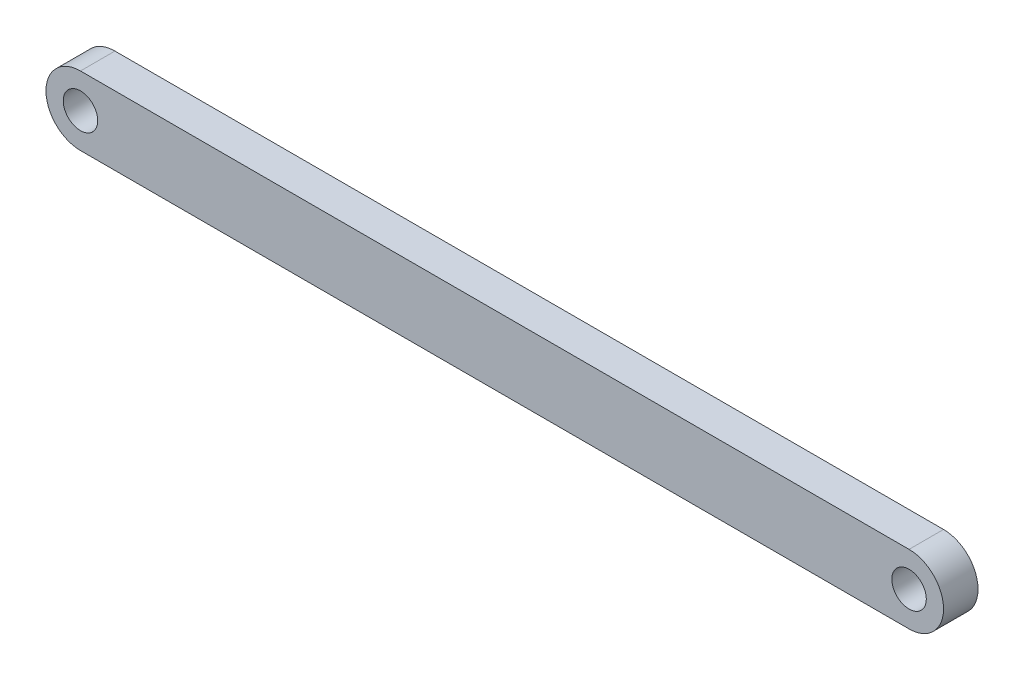
ISO-10303-21;
HEADER;
FILE_DESCRIPTION(('STEP AP214'),'2;1');
FILE_NAME('part.step','',(''),(''),'','','');
FILE_SCHEMA(('AUTOMOTIVE_DESIGN { 1 0 10303 214 1 1 1 1 }'));
ENDSEC;
DATA;
#1=APPLICATION_CONTEXT('core data for automotive mechanical design processes');
#2=APPLICATION_PROTOCOL_DEFINITION('international standard','automotive_design',2000,#1);
#3=PRODUCT_CONTEXT('',#1,'mechanical');
#4=PRODUCT('Part','Part','',(#3));
#5=PRODUCT_RELATED_PRODUCT_CATEGORY('part','',(#4));
#6=PRODUCT_DEFINITION_FORMATION('','',#4);
#7=PRODUCT_DEFINITION_CONTEXT('part definition',#1,'design');
#8=PRODUCT_DEFINITION('design','',#6,#7);
#9=PRODUCT_DEFINITION_SHAPE('','',#8);
#10=(LENGTH_UNIT() NAMED_UNIT(*) SI_UNIT(.MILLI.,.METRE.));
#11=(NAMED_UNIT(*) PLANE_ANGLE_UNIT() SI_UNIT($,.RADIAN.));
#12=(NAMED_UNIT(*) SI_UNIT($,.STERADIAN.) SOLID_ANGLE_UNIT());
#13=UNCERTAINTY_MEASURE_WITH_UNIT(LENGTH_MEASURE(1.E-05),#10,'distance_accuracy_value','');
#14=(GEOMETRIC_REPRESENTATION_CONTEXT(3) GLOBAL_UNCERTAINTY_ASSIGNED_CONTEXT((#13)) GLOBAL_UNIT_ASSIGNED_CONTEXT((#10,
#11,#12)) REPRESENTATION_CONTEXT('',''));
#15=CARTESIAN_POINT('',(0.,0.,0.));
#16=DIRECTION('',(0.,0.,1.));
#17=DIRECTION('',(1.,0.,0.));
#18=AXIS2_PLACEMENT_3D('',#15,#16,#17);
#19=CARTESIAN_POINT('',(-24.0399999679991,0.00124040432424641,2.));
#20=DIRECTION('',(0.,0.,1.));
#21=DIRECTION('',(1.,0.,0.));
#22=AXIS2_PLACEMENT_3D('',#19,#20,#21);
#23=PLANE('',#22);
#24=CARTESIAN_POINT('',(-24.0399999679991,0.00124040432424641,2.));
#25=DIRECTION('',(0.,0.,1.));
#26=DIRECTION('',(1.,0.,0.));
#27=AXIS2_PLACEMENT_3D('',#24,#25,#26);
#28=CIRCLE('',#27,1.);
#29=CARTESIAN_POINT('',(-23.0399999679991,0.00124040432424641,2.));
#30=VERTEX_POINT('',#29);
#31=EDGE_CURVE('E100',#30,#30,#28,.T.);
#32=ORIENTED_EDGE('',*,*,#31,.F.);
#33=EDGE_LOOP('',(#32));
#34=FACE_BOUND('',#33,.T.);
#35=CARTESIAN_POINT('',(-24.0399999679991,0.00124040432424641,2.));
#36=DIRECTION('',(0.,0.,1.));
#37=DIRECTION('',(1.,0.,0.));
#38=AXIS2_PLACEMENT_3D('',#35,#36,#37);
#39=CIRCLE('',#38,2.);
#40=CARTESIAN_POINT('',(-24.0399999679991,2.00124040432425,2.));
#41=VERTEX_POINT('',#40);
#42=CARTESIAN_POINT('',(-24.0399999679991,-1.99875959567575,2.));
#43=VERTEX_POINT('',#42);
#44=EDGE_CURVE('E85',#41,#43,#39,.T.);
#45=ORIENTED_EDGE('',*,*,#44,.T.);
#46=DIRECTION('',(1.,0.,0.));
#47=VECTOR('',#46,1.);
#48=CARTESIAN_POINT('',(-24.0399999679991,-1.99875959567575,2.));
#49=LINE('',#48,#47);
#50=CARTESIAN_POINT('',(24.0400000320009,-1.99875959567575,2.));
#51=VERTEX_POINT('',#50);
#52=EDGE_CURVE('E80',#43,#51,#49,.T.);
#53=ORIENTED_EDGE('',*,*,#52,.T.);
#54=CARTESIAN_POINT('',(24.0400000320009,0.00124040432424641,2.));
#55=DIRECTION('',(0.,0.,1.));
#56=DIRECTION('',(1.,0.,0.));
#57=AXIS2_PLACEMENT_3D('',#54,#55,#56);
#58=CIRCLE('',#57,2.);
#59=CARTESIAN_POINT('',(24.0400000320009,2.00124040432425,2.));
#60=VERTEX_POINT('',#59);
#61=EDGE_CURVE('E83',#51,#60,#58,.T.);
#62=ORIENTED_EDGE('',*,*,#61,.T.);
#63=DIRECTION('',(-1.,0.,0.));
#64=VECTOR('',#63,1.);
#65=CARTESIAN_POINT('',(-24.0399999679991,2.00124040432425,2.));
#66=LINE('',#65,#64);
#67=EDGE_CURVE('E50',#60,#41,#66,.T.);
#68=ORIENTED_EDGE('',*,*,#67,.T.);
#69=EDGE_LOOP('',(#45,#53,#62,#68));
#70=FACE_BOUND('',#69,.T.);
#71=CARTESIAN_POINT('',(24.0400000320009,0.00124040432424641,2.));
#72=DIRECTION('',(0.,0.,1.));
#73=DIRECTION('',(1.,0.,0.));
#74=AXIS2_PLACEMENT_3D('',#71,#72,#73);
#75=CIRCLE('',#74,1.);
#76=CARTESIAN_POINT('',(25.0400000320009,0.00124040432424641,2.));
#77=VERTEX_POINT('',#76);
#78=EDGE_CURVE('E115',#77,#77,#75,.T.);
#79=ORIENTED_EDGE('',*,*,#78,.F.);
#80=EDGE_LOOP('',(#79));
#81=FACE_BOUND('',#80,.T.);
#82=ADVANCED_FACE('F33',(#34,#70,#81),#23,.T.);
#83=CARTESIAN_POINT('',(-24.0399999679991,0.00124040432424641,0.));
#84=DIRECTION('',(0.,0.,1.));
#85=DIRECTION('',(1.,0.,0.));
#86=AXIS2_PLACEMENT_3D('',#83,#84,#85);
#87=PLANE('',#86);
#88=CARTESIAN_POINT('',(-24.0399999679991,0.00124040432424641,0.));
#89=DIRECTION('',(0.,0.,1.));
#90=DIRECTION('',(1.,0.,0.));
#91=AXIS2_PLACEMENT_3D('',#88,#89,#90);
#92=CIRCLE('',#91,2.);
#93=CARTESIAN_POINT('',(-24.0399999679991,2.00124040432425,0.));
#94=VERTEX_POINT('',#93);
#95=CARTESIAN_POINT('',(-24.0399999679991,-1.99875959567575,0.));
#96=VERTEX_POINT('',#95);
#97=EDGE_CURVE('E97',#94,#96,#92,.T.);
#98=ORIENTED_EDGE('',*,*,#97,.F.);
#99=DIRECTION('',(-1.,0.,0.));
#100=VECTOR('',#99,1.);
#101=CARTESIAN_POINT('',(-24.0399999679991,2.00124040432425,0.));
#102=LINE('',#101,#100);
#103=CARTESIAN_POINT('',(24.0400000320009,2.00124040432425,0.));
#104=VERTEX_POINT('',#103);
#105=EDGE_CURVE('E73',#104,#94,#102,.T.);
#106=ORIENTED_EDGE('',*,*,#105,.F.);
#107=CARTESIAN_POINT('',(24.0400000320009,0.00124040432424641,0.));
#108=DIRECTION('',(0.,0.,1.));
#109=DIRECTION('',(1.,0.,0.));
#110=AXIS2_PLACEMENT_3D('',#107,#108,#109);
#111=CIRCLE('',#110,2.);
#112=CARTESIAN_POINT('',(24.0400000320009,-1.99875959567575,0.));
#113=VERTEX_POINT('',#112);
#114=EDGE_CURVE('E67',#113,#104,#111,.T.);
#115=ORIENTED_EDGE('',*,*,#114,.F.);
#116=DIRECTION('',(1.,0.,0.));
#117=VECTOR('',#116,1.);
#118=CARTESIAN_POINT('',(-24.0399999679991,-1.99875959567575,0.));
#119=LINE('',#118,#117);
#120=EDGE_CURVE('E89',#96,#113,#119,.T.);
#121=ORIENTED_EDGE('',*,*,#120,.F.);
#122=EDGE_LOOP('',(#98,#106,#115,#121));
#123=FACE_BOUND('',#122,.T.);
#124=CARTESIAN_POINT('',(-24.0399999679991,0.00124040432424641,0.));
#125=DIRECTION('',(0.,0.,1.));
#126=DIRECTION('',(1.,0.,0.));
#127=AXIS2_PLACEMENT_3D('',#124,#125,#126);
#128=CIRCLE('',#127,1.);
#129=CARTESIAN_POINT('',(-23.0399999679991,0.00124040432424641,0.));
#130=VERTEX_POINT('',#129);
#131=EDGE_CURVE('E112',#130,#130,#128,.T.);
#132=ORIENTED_EDGE('',*,*,#131,.T.);
#133=EDGE_LOOP('',(#132));
#134=FACE_BOUND('',#133,.T.);
#135=CARTESIAN_POINT('',(24.0400000320009,0.00124040432424641,0.));
#136=DIRECTION('',(0.,0.,1.));
#137=DIRECTION('',(1.,0.,0.));
#138=AXIS2_PLACEMENT_3D('',#135,#136,#137);
#139=CIRCLE('',#138,1.);
#140=CARTESIAN_POINT('',(25.0400000320009,0.00124040432424641,0.));
#141=VERTEX_POINT('',#140);
#142=EDGE_CURVE('E118',#141,#141,#139,.T.);
#143=ORIENTED_EDGE('',*,*,#142,.T.);
#144=EDGE_LOOP('',(#143));
#145=FACE_BOUND('',#144,.T.);
#146=ADVANCED_FACE('F108',(#123,#134,#145),#87,.F.);
#147=CARTESIAN_POINT('',(-24.0399999679991,0.00124040432424641,2.));
#148=DIRECTION('',(0.,0.,-1.));
#149=DIRECTION('',(-1.,0.,0.));
#150=AXIS2_PLACEMENT_3D('',#147,#148,#149);
#151=CYLINDRICAL_SURFACE('',#150,2.);
#152=ORIENTED_EDGE('',*,*,#97,.T.);
#153=DIRECTION('',(0.,0.,-1.));
#154=VECTOR('',#153,1.);
#155=CARTESIAN_POINT('',(-24.0399999679991,-1.99875959567575,2.));
#156=LINE('',#155,#154);
#157=EDGE_CURVE('E11',#43,#96,#156,.T.);
#158=ORIENTED_EDGE('',*,*,#157,.F.);
#159=ORIENTED_EDGE('',*,*,#44,.F.);
#160=DIRECTION('',(0.,0.,-1.));
#161=VECTOR('',#160,1.);
#162=CARTESIAN_POINT('',(-24.0399999679991,2.00124040432425,2.));
#163=LINE('',#162,#161);
#164=EDGE_CURVE('E93',#41,#94,#163,.T.);
#165=ORIENTED_EDGE('',*,*,#164,.T.);
#166=EDGE_LOOP('',(#152,#158,#159,#165));
#167=FACE_BOUND('',#166,.T.);
#168=ADVANCED_FACE('F35',(#167),#151,.T.);
#169=CARTESIAN_POINT('',(-24.0399999679991,-1.99875959567575,2.));
#170=DIRECTION('',(0.,1.,0.));
#171=DIRECTION('',(0.,0.,1.));
#172=AXIS2_PLACEMENT_3D('',#169,#170,#171);
#173=PLANE('',#172);
#174=ORIENTED_EDGE('',*,*,#120,.T.);
#175=DIRECTION('',(0.,0.,-1.));
#176=VECTOR('',#175,1.);
#177=CARTESIAN_POINT('',(24.0400000320009,-1.99875959567575,2.));
#178=LINE('',#177,#176);
#179=EDGE_CURVE('E42',#51,#113,#178,.T.);
#180=ORIENTED_EDGE('',*,*,#179,.F.);
#181=ORIENTED_EDGE('',*,*,#52,.F.);
#182=ORIENTED_EDGE('',*,*,#157,.T.);
#183=EDGE_LOOP('',(#174,#180,#181,#182));
#184=FACE_BOUND('',#183,.T.);
#185=ADVANCED_FACE('F88',(#184),#173,.F.);
#186=CARTESIAN_POINT('',(24.0400000320009,0.00124040432424641,2.));
#187=DIRECTION('',(0.,0.,-1.));
#188=DIRECTION('',(-1.,0.,0.));
#189=AXIS2_PLACEMENT_3D('',#186,#187,#188);
#190=CYLINDRICAL_SURFACE('',#189,2.);
#191=ORIENTED_EDGE('',*,*,#114,.T.);
#192=DIRECTION('',(0.,0.,-1.));
#193=VECTOR('',#192,1.);
#194=CARTESIAN_POINT('',(24.0400000320009,2.00124040432425,2.));
#195=LINE('',#194,#193);
#196=EDGE_CURVE('E90',#60,#104,#195,.T.);
#197=ORIENTED_EDGE('',*,*,#196,.F.);
#198=ORIENTED_EDGE('',*,*,#61,.F.);
#199=ORIENTED_EDGE('',*,*,#179,.T.);
#200=EDGE_LOOP('',(#191,#197,#198,#199));
#201=FACE_BOUND('',#200,.T.);
#202=ADVANCED_FACE('F91',(#201),#190,.T.);
#203=CARTESIAN_POINT('',(-24.0399999679991,2.00124040432425,2.));
#204=DIRECTION('',(0.,-1.,0.));
#205=DIRECTION('',(0.,0.,-1.));
#206=AXIS2_PLACEMENT_3D('',#203,#204,#205);
#207=PLANE('',#206);
#208=ORIENTED_EDGE('',*,*,#105,.T.);
#209=ORIENTED_EDGE('',*,*,#164,.F.);
#210=ORIENTED_EDGE('',*,*,#67,.F.);
#211=ORIENTED_EDGE('',*,*,#196,.T.);
#212=EDGE_LOOP('',(#208,#209,#210,#211));
#213=FACE_BOUND('',#212,.T.);
#214=ADVANCED_FACE('F105',(#213),#207,.F.);
#215=CARTESIAN_POINT('',(-24.0399999679991,0.00124040432424641,2.));
#216=DIRECTION('',(0.,0.,-1.));
#217=DIRECTION('',(-1.,0.,0.));
#218=AXIS2_PLACEMENT_3D('',#215,#216,#217);
#219=CYLINDRICAL_SURFACE('',#218,1.);
#220=ORIENTED_EDGE('',*,*,#31,.T.);
#221=EDGE_LOOP('',(#220));
#222=FACE_BOUND('',#221,.T.);
#223=ORIENTED_EDGE('',*,*,#131,.F.);
#224=EDGE_LOOP('',(#223));
#225=FACE_BOUND('',#224,.T.);
#226=ADVANCED_FACE('F135',(#222,#225),#219,.F.);
#227=CARTESIAN_POINT('',(24.0400000320009,0.00124040432424641,2.));
#228=DIRECTION('',(0.,0.,-1.));
#229=DIRECTION('',(-1.,0.,0.));
#230=AXIS2_PLACEMENT_3D('',#227,#228,#229);
#231=CYLINDRICAL_SURFACE('',#230,1.);
#232=ORIENTED_EDGE('',*,*,#78,.T.);
#233=EDGE_LOOP('',(#232));
#234=FACE_BOUND('',#233,.T.);
#235=ORIENTED_EDGE('',*,*,#142,.F.);
#236=EDGE_LOOP('',(#235));
#237=FACE_BOUND('',#236,.T.);
#238=ADVANCED_FACE('F124',(#234,#237),#231,.F.);
#239=CLOSED_SHELL('',(#82,#146,#168,#185,#202,#214,#226,#238));
#240=MANIFOLD_SOLID_BREP('B2',#239);
#241=ADVANCED_BREP_SHAPE_REPRESENTATION('',(#18,#240),#14);
#242=SHAPE_DEFINITION_REPRESENTATION(#9,#241);
ENDSEC;
END-ISO-10303-21;
